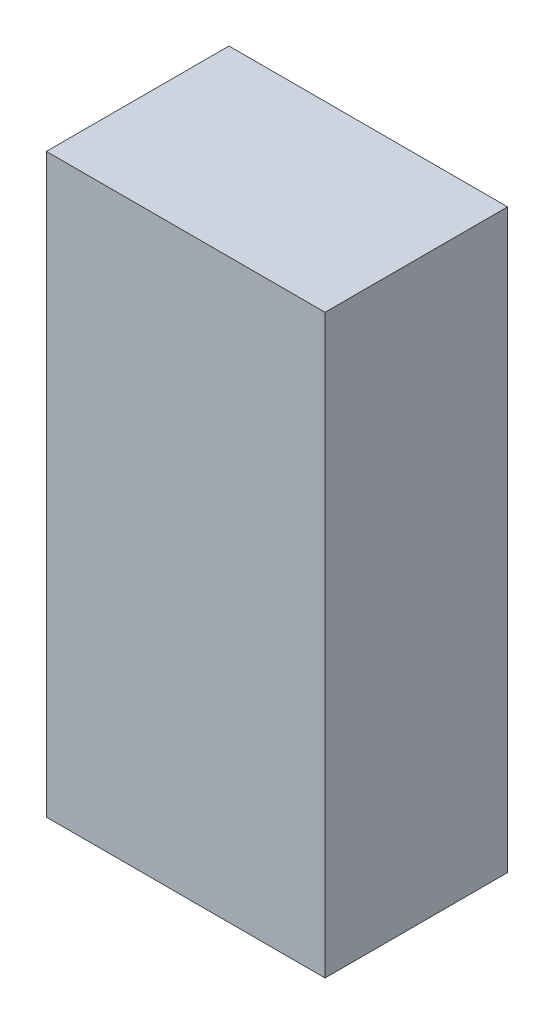
ISO-10303-21;
HEADER;
FILE_DESCRIPTION(('STEP AP214'),'2;1');
FILE_NAME('part.step','',(''),(''),'','','');
FILE_SCHEMA(('AUTOMOTIVE_DESIGN { 1 0 10303 214 1 1 1 1 }'));
ENDSEC;
DATA;
#1=APPLICATION_CONTEXT('core data for automotive mechanical design processes');
#2=APPLICATION_PROTOCOL_DEFINITION('international standard','automotive_design',2000,#1);
#3=PRODUCT_CONTEXT('',#1,'mechanical');
#4=PRODUCT('Part','Part','',(#3));
#5=PRODUCT_RELATED_PRODUCT_CATEGORY('part','',(#4));
#6=PRODUCT_DEFINITION_FORMATION('','',#4);
#7=PRODUCT_DEFINITION_CONTEXT('part definition',#1,'design');
#8=PRODUCT_DEFINITION('design','',#6,#7);
#9=PRODUCT_DEFINITION_SHAPE('','',#8);
#10=(LENGTH_UNIT() NAMED_UNIT(*) SI_UNIT(.MILLI.,.METRE.));
#11=(NAMED_UNIT(*) PLANE_ANGLE_UNIT() SI_UNIT($,.RADIAN.));
#12=(NAMED_UNIT(*) SI_UNIT($,.STERADIAN.) SOLID_ANGLE_UNIT());
#13=UNCERTAINTY_MEASURE_WITH_UNIT(LENGTH_MEASURE(1.E-05),#10,'distance_accuracy_value','');
#14=(GEOMETRIC_REPRESENTATION_CONTEXT(3) GLOBAL_UNCERTAINTY_ASSIGNED_CONTEXT((#13)) GLOBAL_UNIT_ASSIGNED_CONTEXT((#10,
#11,#12)) REPRESENTATION_CONTEXT('',''));
#15=CARTESIAN_POINT('',(0.,0.,0.));
#16=DIRECTION('',(0.,0.,1.));
#17=DIRECTION('',(1.,0.,0.));
#18=AXIS2_PLACEMENT_3D('',#15,#16,#17);
#19=CARTESIAN_POINT('',(0.,762.,0.));
#20=DIRECTION('',(1.,0.,0.));
#21=DIRECTION('',(0.,0.,-1.));
#22=AXIS2_PLACEMENT_3D('',#19,#20,#21);
#23=PLANE('',#22);
#24=DIRECTION('',(0.,0.,1.));
#25=VECTOR('',#24,1.);
#26=CARTESIAN_POINT('',(0.,0.,0.));
#27=LINE('',#26,#25);
#28=CARTESIAN_POINT('',(0.,0.,-241.3));
#29=VERTEX_POINT('',#28);
#30=CARTESIAN_POINT('',(0.,0.,0.));
#31=VERTEX_POINT('',#30);
#32=EDGE_CURVE('E94',#29,#31,#27,.T.);
#33=ORIENTED_EDGE('',*,*,#32,.T.);
#34=DIRECTION('',(0.,-1.,0.));
#35=VECTOR('',#34,1.);
#36=CARTESIAN_POINT('',(0.,762.,0.));
#37=LINE('',#36,#35);
#38=CARTESIAN_POINT('',(0.,762.,0.));
#39=VERTEX_POINT('',#38);
#40=EDGE_CURVE('E11',#39,#31,#37,.T.);
#41=ORIENTED_EDGE('',*,*,#40,.F.);
#42=DIRECTION('',(0.,0.,1.));
#43=VECTOR('',#42,1.);
#44=CARTESIAN_POINT('',(0.,762.,0.));
#45=LINE('',#44,#43);
#46=CARTESIAN_POINT('',(0.,762.,-241.3));
#47=VERTEX_POINT('',#46);
#48=EDGE_CURVE('E82',#47,#39,#45,.T.);
#49=ORIENTED_EDGE('',*,*,#48,.F.);
#50=DIRECTION('',(0.,-1.,0.));
#51=VECTOR('',#50,1.);
#52=CARTESIAN_POINT('',(0.,762.,-241.3));
#53=LINE('',#52,#51);
#54=EDGE_CURVE('E90',#47,#29,#53,.T.);
#55=ORIENTED_EDGE('',*,*,#54,.T.);
#56=EDGE_LOOP('',(#33,#41,#49,#55));
#57=FACE_BOUND('',#56,.T.);
#58=ADVANCED_FACE('F31',(#57),#23,.F.);
#59=CARTESIAN_POINT('',(0.,762.,0.));
#60=DIRECTION('',(0.,0.,-1.));
#61=DIRECTION('',(-1.,0.,0.));
#62=AXIS2_PLACEMENT_3D('',#59,#60,#61);
#63=PLANE('',#62);
#64=DIRECTION('',(1.,0.,0.));
#65=VECTOR('',#64,1.);
#66=CARTESIAN_POINT('',(0.,0.,0.));
#67=LINE('',#66,#65);
#68=CARTESIAN_POINT('',(368.3,0.,0.));
#69=VERTEX_POINT('',#68);
#70=EDGE_CURVE('E86',#31,#69,#67,.T.);
#71=ORIENTED_EDGE('',*,*,#70,.T.);
#72=DIRECTION('',(0.,-1.,0.));
#73=VECTOR('',#72,1.);
#74=CARTESIAN_POINT('',(368.3,762.,0.));
#75=LINE('',#74,#73);
#76=CARTESIAN_POINT('',(368.3,762.,0.));
#77=VERTEX_POINT('',#76);
#78=EDGE_CURVE('E39',#77,#69,#75,.T.);
#79=ORIENTED_EDGE('',*,*,#78,.F.);
#80=DIRECTION('',(1.,0.,0.));
#81=VECTOR('',#80,1.);
#82=CARTESIAN_POINT('',(0.,762.,0.));
#83=LINE('',#82,#81);
#84=EDGE_CURVE('E77',#39,#77,#83,.T.);
#85=ORIENTED_EDGE('',*,*,#84,.F.);
#86=ORIENTED_EDGE('',*,*,#40,.T.);
#87=EDGE_LOOP('',(#71,#79,#85,#86));
#88=FACE_BOUND('',#87,.T.);
#89=ADVANCED_FACE('F85',(#88),#63,.F.);
#90=CARTESIAN_POINT('',(368.3,762.,0.));
#91=DIRECTION('',(-1.,0.,0.));
#92=DIRECTION('',(0.,0.,1.));
#93=AXIS2_PLACEMENT_3D('',#90,#91,#92);
#94=PLANE('',#93);
#95=DIRECTION('',(0.,0.,-1.));
#96=VECTOR('',#95,1.);
#97=CARTESIAN_POINT('',(368.3,0.,0.));
#98=LINE('',#97,#96);
#99=CARTESIAN_POINT('',(368.3,0.,-241.3));
#100=VERTEX_POINT('',#99);
#101=EDGE_CURVE('E64',#69,#100,#98,.T.);
#102=ORIENTED_EDGE('',*,*,#101,.T.);
#103=DIRECTION('',(0.,-1.,0.));
#104=VECTOR('',#103,1.);
#105=CARTESIAN_POINT('',(368.3,762.,-241.3));
#106=LINE('',#105,#104);
#107=CARTESIAN_POINT('',(368.3,762.,-241.3));
#108=VERTEX_POINT('',#107);
#109=EDGE_CURVE('E87',#108,#100,#106,.T.);
#110=ORIENTED_EDGE('',*,*,#109,.F.);
#111=DIRECTION('',(0.,0.,-1.));
#112=VECTOR('',#111,1.);
#113=CARTESIAN_POINT('',(368.3,762.,0.));
#114=LINE('',#113,#112);
#115=EDGE_CURVE('E80',#77,#108,#114,.T.);
#116=ORIENTED_EDGE('',*,*,#115,.F.);
#117=ORIENTED_EDGE('',*,*,#78,.T.);
#118=EDGE_LOOP('',(#102,#110,#116,#117));
#119=FACE_BOUND('',#118,.T.);
#120=ADVANCED_FACE('F88',(#119),#94,.F.);
#121=CARTESIAN_POINT('',(0.,762.,-241.3));
#122=DIRECTION('',(0.,0.,1.));
#123=DIRECTION('',(1.,0.,0.));
#124=AXIS2_PLACEMENT_3D('',#121,#122,#123);
#125=PLANE('',#124);
#126=DIRECTION('',(-1.,0.,0.));
#127=VECTOR('',#126,1.);
#128=CARTESIAN_POINT('',(0.,0.,-241.3));
#129=LINE('',#128,#127);
#130=EDGE_CURVE('E70',#100,#29,#129,.T.);
#131=ORIENTED_EDGE('',*,*,#130,.T.);
#132=ORIENTED_EDGE('',*,*,#54,.F.);
#133=DIRECTION('',(-1.,0.,0.));
#134=VECTOR('',#133,1.);
#135=CARTESIAN_POINT('',(0.,762.,-241.3));
#136=LINE('',#135,#134);
#137=EDGE_CURVE('E47',#108,#47,#136,.T.);
#138=ORIENTED_EDGE('',*,*,#137,.F.);
#139=ORIENTED_EDGE('',*,*,#109,.T.);
#140=EDGE_LOOP('',(#131,#132,#138,#139));
#141=FACE_BOUND('',#140,.T.);
#142=ADVANCED_FACE('F101',(#141),#125,.F.);
#143=CARTESIAN_POINT('',(0.,762.,-241.3));
#144=DIRECTION('',(0.,-1.,0.));
#145=DIRECTION('',(0.,0.,-1.));
#146=AXIS2_PLACEMENT_3D('',#143,#144,#145);
#147=PLANE('',#146);
#148=ORIENTED_EDGE('',*,*,#48,.T.);
#149=ORIENTED_EDGE('',*,*,#84,.T.);
#150=ORIENTED_EDGE('',*,*,#115,.T.);
#151=ORIENTED_EDGE('',*,*,#137,.T.);
#152=EDGE_LOOP('',(#148,#149,#150,#151));
#153=FACE_BOUND('',#152,.T.);
#154=ADVANCED_FACE('F78',(#153),#147,.F.);
#155=CARTESIAN_POINT('',(0.,0.,-241.3));
#156=DIRECTION('',(0.,-1.,0.));
#157=DIRECTION('',(0.,0.,-1.));
#158=AXIS2_PLACEMENT_3D('',#155,#156,#157);
#159=PLANE('',#158);
#160=ORIENTED_EDGE('',*,*,#32,.F.);
#161=ORIENTED_EDGE('',*,*,#130,.F.);
#162=ORIENTED_EDGE('',*,*,#101,.F.);
#163=ORIENTED_EDGE('',*,*,#70,.F.);
#164=EDGE_LOOP('',(#160,#161,#162,#163));
#165=FACE_BOUND('',#164,.T.);
#166=ADVANCED_FACE('F104',(#165),#159,.T.);
#167=CLOSED_SHELL('',(#58,#89,#120,#142,#154,#166));
#168=MANIFOLD_SOLID_BREP('B2',#167);
#169=ADVANCED_BREP_SHAPE_REPRESENTATION('',(#18,#168),#14);
#170=SHAPE_DEFINITION_REPRESENTATION(#9,#169);
ENDSEC;
END-ISO-10303-21;
